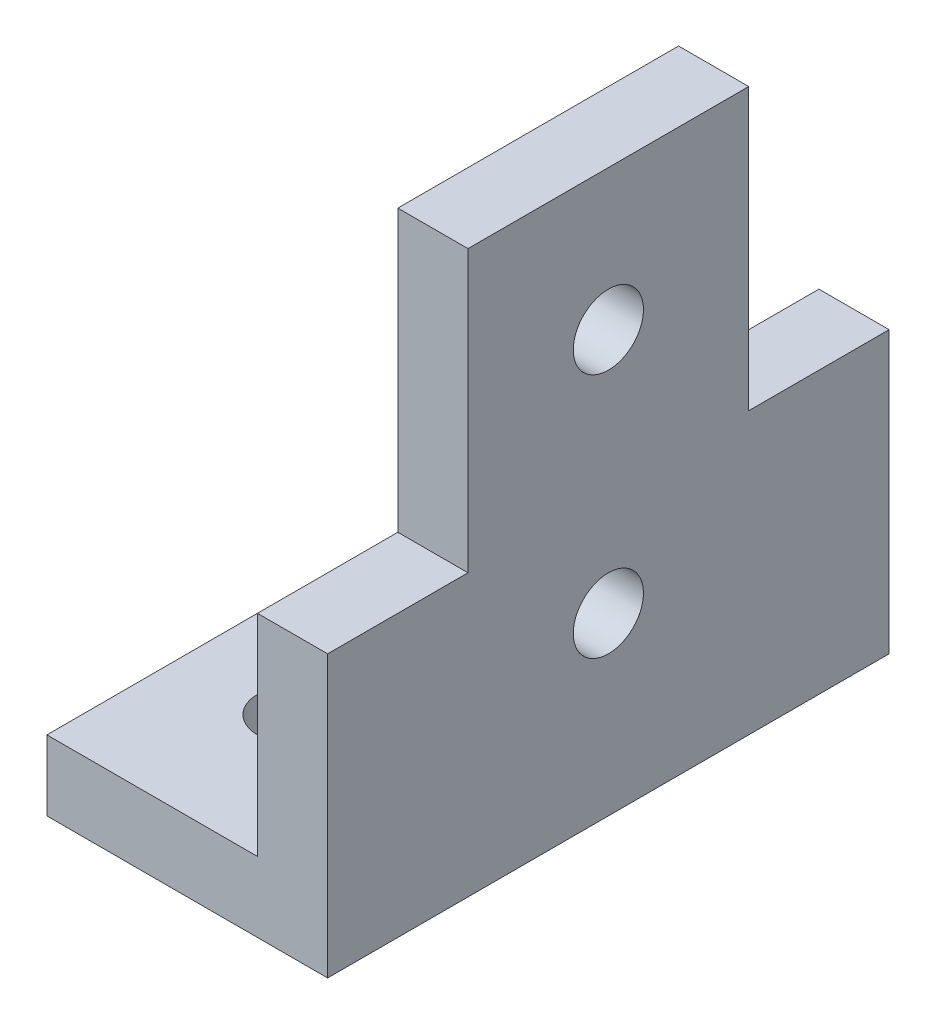
ISO-10303-21;
HEADER;
FILE_DESCRIPTION(('STEP AP214'),'2;1');
FILE_NAME('part.step','',(''),(''),'','','');
FILE_SCHEMA(('AUTOMOTIVE_DESIGN { 1 0 10303 214 1 1 1 1 }'));
ENDSEC;
DATA;
#1=APPLICATION_CONTEXT('core data for automotive mechanical design processes');
#2=APPLICATION_PROTOCOL_DEFINITION('international standard','automotive_design',2000,#1);
#3=PRODUCT_CONTEXT('',#1,'mechanical');
#4=PRODUCT('Part','Part','',(#3));
#5=PRODUCT_RELATED_PRODUCT_CATEGORY('part','',(#4));
#6=PRODUCT_DEFINITION_FORMATION('','',#4);
#7=PRODUCT_DEFINITION_CONTEXT('part definition',#1,'design');
#8=PRODUCT_DEFINITION('design','',#6,#7);
#9=PRODUCT_DEFINITION_SHAPE('','',#8);
#10=(LENGTH_UNIT() NAMED_UNIT(*) SI_UNIT(.MILLI.,.METRE.));
#11=(NAMED_UNIT(*) PLANE_ANGLE_UNIT() SI_UNIT($,.RADIAN.));
#12=(NAMED_UNIT(*) SI_UNIT($,.STERADIAN.) SOLID_ANGLE_UNIT());
#13=UNCERTAINTY_MEASURE_WITH_UNIT(LENGTH_MEASURE(1.E-05),#10,'distance_accuracy_value','');
#14=(GEOMETRIC_REPRESENTATION_CONTEXT(3) GLOBAL_UNCERTAINTY_ASSIGNED_CONTEXT((#13)) GLOBAL_UNIT_ASSIGNED_CONTEXT((#10,
#11,#12)) REPRESENTATION_CONTEXT('',''));
#15=CARTESIAN_POINT('',(0.,0.,0.));
#16=DIRECTION('',(0.,0.,1.));
#17=DIRECTION('',(1.,0.,0.));
#18=AXIS2_PLACEMENT_3D('',#15,#16,#17);
#19=CARTESIAN_POINT('',(25.4,25.4,50.8));
#20=DIRECTION('',(0.,-1.,0.));
#21=DIRECTION('',(1.,0.,0.));
#22=AXIS2_PLACEMENT_3D('',#19,#20,#21);
#23=PLANE('',#22);
#24=DIRECTION('',(-1.,0.,0.));
#25=VECTOR('',#24,1.);
#26=CARTESIAN_POINT('',(25.4,25.4,12.7));
#27=LINE('',#26,#25);
#28=CARTESIAN_POINT('',(25.4,25.4,12.7));
#29=VERTEX_POINT('',#28);
#30=CARTESIAN_POINT('',(19.05,25.4,12.7));
#31=VERTEX_POINT('',#30);
#32=EDGE_CURVE('E174',#29,#31,#27,.T.);
#33=ORIENTED_EDGE('',*,*,#32,.F.);
#34=DIRECTION('',(0.,0.,-1.));
#35=VECTOR('',#34,1.);
#36=CARTESIAN_POINT('',(25.4,25.4,50.8));
#37=LINE('',#36,#35);
#38=CARTESIAN_POINT('',(25.4,25.4,0.));
#39=VERTEX_POINT('',#38);
#40=EDGE_CURVE('E123',#29,#39,#37,.T.);
#41=ORIENTED_EDGE('',*,*,#40,.T.);
#42=DIRECTION('',(-1.,0.,0.));
#43=VECTOR('',#42,1.);
#44=CARTESIAN_POINT('',(25.4,25.4,0.));
#45=LINE('',#44,#43);
#46=CARTESIAN_POINT('',(19.05,25.4,0.));
#47=VERTEX_POINT('',#46);
#48=EDGE_CURVE('E144',#39,#47,#45,.T.);
#49=ORIENTED_EDGE('',*,*,#48,.T.);
#50=DIRECTION('',(0.,0.,-1.));
#51=VECTOR('',#50,1.);
#52=CARTESIAN_POINT('',(19.05,25.4,50.8));
#53=LINE('',#52,#51);
#54=EDGE_CURVE('E124',#31,#47,#53,.T.);
#55=ORIENTED_EDGE('',*,*,#54,.F.);
#56=EDGE_LOOP('',(#33,#41,#49,#55));
#57=FACE_BOUND('',#56,.T.);
#58=ADVANCED_FACE('F35',(#57),#23,.F.);
#59=CARTESIAN_POINT('',(0.,0.,50.8));
#60=DIRECTION('',(1.,0.,0.));
#61=DIRECTION('',(0.,0.,-1.));
#62=AXIS2_PLACEMENT_3D('',#59,#60,#61);
#63=PLANE('',#62);
#64=DIRECTION('',(0.,-1.,0.));
#65=VECTOR('',#64,1.);
#66=CARTESIAN_POINT('',(0.,0.,0.));
#67=LINE('',#66,#65);
#68=CARTESIAN_POINT('',(0.,6.35,0.));
#69=VERTEX_POINT('',#68);
#70=CARTESIAN_POINT('',(0.,0.,0.));
#71=VERTEX_POINT('',#70);
#72=EDGE_CURVE('E134',#69,#71,#67,.T.);
#73=ORIENTED_EDGE('',*,*,#72,.T.);
#74=DIRECTION('',(0.,0.,-1.));
#75=VECTOR('',#74,1.);
#76=CARTESIAN_POINT('',(0.,0.,50.8));
#77=LINE('',#76,#75);
#78=CARTESIAN_POINT('',(0.,0.,50.8));
#79=VERTEX_POINT('',#78);
#80=EDGE_CURVE('E11',#79,#71,#77,.T.);
#81=ORIENTED_EDGE('',*,*,#80,.F.);
#82=DIRECTION('',(0.,-1.,0.));
#83=VECTOR('',#82,1.);
#84=CARTESIAN_POINT('',(0.,0.,50.8));
#85=LINE('',#84,#83);
#86=CARTESIAN_POINT('',(0.,6.35,50.8));
#87=VERTEX_POINT('',#86);
#88=EDGE_CURVE('E150',#87,#79,#85,.T.);
#89=ORIENTED_EDGE('',*,*,#88,.F.);
#90=DIRECTION('',(0.,0.,-1.));
#91=VECTOR('',#90,1.);
#92=CARTESIAN_POINT('',(0.,6.35,50.8));
#93=LINE('',#92,#91);
#94=EDGE_CURVE('E130',#87,#69,#93,.T.);
#95=ORIENTED_EDGE('',*,*,#94,.T.);
#96=EDGE_LOOP('',(#73,#81,#89,#95));
#97=FACE_BOUND('',#96,.T.);
#98=ADVANCED_FACE('F37',(#97),#63,.F.);
#99=CARTESIAN_POINT('',(0.,0.,50.8));
#100=DIRECTION('',(0.,1.,0.));
#101=DIRECTION('',(0.,0.,1.));
#102=AXIS2_PLACEMENT_3D('',#99,#100,#101);
#103=PLANE('',#102);
#104=CARTESIAN_POINT('',(9.525,0.,38.1));
#105=DIRECTION('',(0.,1.,0.));
#106=DIRECTION('',(0.,0.,1.));
#107=AXIS2_PLACEMENT_3D('',#104,#105,#106);
#108=CIRCLE('',#107,3.175);
#109=CARTESIAN_POINT('',(9.525,0.,41.275));
#110=VERTEX_POINT('',#109);
#111=EDGE_CURVE('E287',#110,#110,#108,.F.);
#112=ORIENTED_EDGE('',*,*,#111,.F.);
#113=EDGE_LOOP('',(#112));
#114=FACE_BOUND('',#113,.T.);
#115=CARTESIAN_POINT('',(9.525,0.,12.7));
#116=DIRECTION('',(0.,1.,0.));
#117=DIRECTION('',(0.,0.,1.));
#118=AXIS2_PLACEMENT_3D('',#115,#116,#117);
#119=CIRCLE('',#118,3.175);
#120=CARTESIAN_POINT('',(9.525,0.,15.875));
#121=VERTEX_POINT('',#120);
#122=EDGE_CURVE('E138',#121,#121,#119,.F.);
#123=ORIENTED_EDGE('',*,*,#122,.F.);
#124=EDGE_LOOP('',(#123));
#125=FACE_BOUND('',#124,.T.);
#126=DIRECTION('',(1.,0.,0.));
#127=VECTOR('',#126,1.);
#128=CARTESIAN_POINT('',(0.,0.,0.));
#129=LINE('',#128,#127);
#130=CARTESIAN_POINT('',(25.4,0.,0.));
#131=VERTEX_POINT('',#130);
#132=EDGE_CURVE('E137',#71,#131,#129,.T.);
#133=ORIENTED_EDGE('',*,*,#132,.T.);
#134=DIRECTION('',(0.,0.,-1.));
#135=VECTOR('',#134,1.);
#136=CARTESIAN_POINT('',(25.4,0.,50.8));
#137=LINE('',#136,#135);
#138=CARTESIAN_POINT('',(25.4,0.,50.8));
#139=VERTEX_POINT('',#138);
#140=EDGE_CURVE('E44',#139,#131,#137,.T.);
#141=ORIENTED_EDGE('',*,*,#140,.F.);
#142=DIRECTION('',(1.,0.,0.));
#143=VECTOR('',#142,1.);
#144=CARTESIAN_POINT('',(0.,0.,50.8));
#145=LINE('',#144,#143);
#146=EDGE_CURVE('E96',#79,#139,#145,.T.);
#147=ORIENTED_EDGE('',*,*,#146,.F.);
#148=ORIENTED_EDGE('',*,*,#80,.T.);
#149=EDGE_LOOP('',(#133,#141,#147,#148));
#150=FACE_BOUND('',#149,.T.);
#151=ADVANCED_FACE('F246',(#114,#125,#150),#103,.F.);
#152=CARTESIAN_POINT('',(25.4,16.8521862769744,50.8));
#153=DIRECTION('',(-1.,0.,0.));
#154=DIRECTION('',(0.,0.,1.));
#155=AXIS2_PLACEMENT_3D('',#152,#153,#154);
#156=PLANE('',#155);
#157=CARTESIAN_POINT('',(25.4,15.875,25.4));
#158=DIRECTION('',(-1.,0.,0.));
#159=DIRECTION('',(0.,0.,1.));
#160=AXIS2_PLACEMENT_3D('',#157,#158,#159);
#161=CIRCLE('',#160,3.175);
#162=CARTESIAN_POINT('',(25.4,15.875,28.575));
#163=VERTEX_POINT('',#162);
#164=EDGE_CURVE('E216',#163,#163,#161,.F.);
#165=ORIENTED_EDGE('',*,*,#164,.F.);
#166=EDGE_LOOP('',(#165));
#167=FACE_BOUND('',#166,.T.);
#168=DIRECTION('',(0.,1.,0.));
#169=VECTOR('',#168,1.);
#170=CARTESIAN_POINT('',(25.4,16.8521862769744,0.));
#171=LINE('',#170,#169);
#172=EDGE_CURVE('E141',#131,#39,#171,.T.);
#173=ORIENTED_EDGE('',*,*,#172,.T.);
#174=ORIENTED_EDGE('',*,*,#40,.F.);
#175=DIRECTION('',(0.,-1.,0.));
#176=VECTOR('',#175,1.);
#177=CARTESIAN_POINT('',(25.4,25.4,12.7));
#178=LINE('',#177,#176);
#179=CARTESIAN_POINT('',(25.4,50.8,12.7));
#180=VERTEX_POINT('',#179);
#181=EDGE_CURVE('E190',#180,#29,#178,.T.);
#182=ORIENTED_EDGE('',*,*,#181,.F.);
#183=DIRECTION('',(0.,0.,-1.));
#184=VECTOR('',#183,1.);
#185=CARTESIAN_POINT('',(25.4,50.8,12.7));
#186=LINE('',#185,#184);
#187=CARTESIAN_POINT('',(25.4,50.8,38.1));
#188=VERTEX_POINT('',#187);
#189=EDGE_CURVE('E188',#188,#180,#186,.T.);
#190=ORIENTED_EDGE('',*,*,#189,.F.);
#191=DIRECTION('',(0.,1.,0.));
#192=VECTOR('',#191,1.);
#193=CARTESIAN_POINT('',(25.4,25.4,38.1));
#194=LINE('',#193,#192);
#195=CARTESIAN_POINT('',(25.4,25.4,38.1));
#196=VERTEX_POINT('',#195);
#197=EDGE_CURVE('E175',#196,#188,#194,.T.);
#198=ORIENTED_EDGE('',*,*,#197,.F.);
#199=CARTESIAN_POINT('',(25.4,25.4,50.8));
#200=VERTEX_POINT('',#199);
#201=EDGE_CURVE('E161',#200,#196,#37,.T.);
#202=ORIENTED_EDGE('',*,*,#201,.F.);
#203=DIRECTION('',(0.,1.,0.));
#204=VECTOR('',#203,1.);
#205=CARTESIAN_POINT('',(25.4,0.,50.8));
#206=LINE('',#205,#204);
#207=EDGE_CURVE('E113',#139,#200,#206,.T.);
#208=ORIENTED_EDGE('',*,*,#207,.F.);
#209=ORIENTED_EDGE('',*,*,#140,.T.);
#210=EDGE_LOOP('',(#173,#174,#182,#190,#198,#202,#208,#209));
#211=FACE_BOUND('',#210,.T.);
#212=CARTESIAN_POINT('',(25.4,38.1,25.4));
#213=DIRECTION('',(-1.,0.,0.));
#214=DIRECTION('',(0.,0.,1.));
#215=AXIS2_PLACEMENT_3D('',#212,#213,#214);
#216=CIRCLE('',#215,3.175);
#217=CARTESIAN_POINT('',(25.4,38.1,28.575));
#218=VERTEX_POINT('',#217);
#219=EDGE_CURVE('E195',#218,#218,#216,.T.);
#220=ORIENTED_EDGE('',*,*,#219,.T.);
#221=EDGE_LOOP('',(#220));
#222=FACE_BOUND('',#221,.T.);
#223=ADVANCED_FACE('F252',(#167,#211,#222),#156,.F.);
#224=ORIENTED_EDGE('',*,*,#201,.T.);
#225=DIRECTION('',(-1.,0.,0.));
#226=VECTOR('',#225,1.);
#227=CARTESIAN_POINT('',(25.4,25.4,38.1));
#228=LINE('',#227,#226);
#229=CARTESIAN_POINT('',(19.05,25.4,38.1));
#230=VERTEX_POINT('',#229);
#231=EDGE_CURVE('E121',#196,#230,#228,.T.);
#232=ORIENTED_EDGE('',*,*,#231,.T.);
#233=CARTESIAN_POINT('',(19.05,25.4,50.8));
#234=VERTEX_POINT('',#233);
#235=EDGE_CURVE('E119',#234,#230,#53,.T.);
#236=ORIENTED_EDGE('',*,*,#235,.F.);
#237=DIRECTION('',(-1.,0.,0.));
#238=VECTOR('',#237,1.);
#239=CARTESIAN_POINT('',(25.4,25.4,50.8));
#240=LINE('',#239,#238);
#241=EDGE_CURVE('E106',#200,#234,#240,.T.);
#242=ORIENTED_EDGE('',*,*,#241,.F.);
#243=EDGE_LOOP('',(#224,#232,#236,#242));
#244=FACE_BOUND('',#243,.T.);
#245=ADVANCED_FACE('F120',(#244),#23,.F.);
#246=CARTESIAN_POINT('',(19.05,6.35,50.8));
#247=DIRECTION('',(1.,0.,0.));
#248=DIRECTION('',(0.,0.,-1.));
#249=AXIS2_PLACEMENT_3D('',#246,#247,#248);
#250=PLANE('',#249);
#251=CARTESIAN_POINT('',(19.05,15.875,25.4));
#252=DIRECTION('',(-1.,0.,0.));
#253=DIRECTION('',(0.,0.,1.));
#254=AXIS2_PLACEMENT_3D('',#251,#252,#253);
#255=CIRCLE('',#254,3.175);
#256=CARTESIAN_POINT('',(19.05,15.875,28.575));
#257=VERTEX_POINT('',#256);
#258=EDGE_CURVE('E183',#257,#257,#255,.T.);
#259=ORIENTED_EDGE('',*,*,#258,.F.);
#260=EDGE_LOOP('',(#259));
#261=FACE_BOUND('',#260,.T.);
#262=DIRECTION('',(0.,-1.,0.));
#263=VECTOR('',#262,1.);
#264=CARTESIAN_POINT('',(19.05,6.35,0.));
#265=LINE('',#264,#263);
#266=CARTESIAN_POINT('',(19.05,6.35,0.));
#267=VERTEX_POINT('',#266);
#268=EDGE_CURVE('E147',#47,#267,#265,.T.);
#269=ORIENTED_EDGE('',*,*,#268,.T.);
#270=DIRECTION('',(0.,0.,-1.));
#271=VECTOR('',#270,1.);
#272=CARTESIAN_POINT('',(19.05,6.35,50.8));
#273=LINE('',#272,#271);
#274=CARTESIAN_POINT('',(19.05,6.35,50.8));
#275=VERTEX_POINT('',#274);
#276=EDGE_CURVE('E128',#275,#267,#273,.T.);
#277=ORIENTED_EDGE('',*,*,#276,.F.);
#278=DIRECTION('',(0.,-1.,0.));
#279=VECTOR('',#278,1.);
#280=CARTESIAN_POINT('',(19.05,6.35,50.8));
#281=LINE('',#280,#279);
#282=EDGE_CURVE('E110',#234,#275,#281,.T.);
#283=ORIENTED_EDGE('',*,*,#282,.F.);
#284=ORIENTED_EDGE('',*,*,#235,.T.);
#285=DIRECTION('',(0.,1.,0.));
#286=VECTOR('',#285,1.);
#287=CARTESIAN_POINT('',(19.05,25.4,38.1));
#288=LINE('',#287,#286);
#289=CARTESIAN_POINT('',(19.05,50.8,38.1));
#290=VERTEX_POINT('',#289);
#291=EDGE_CURVE('E52',#230,#290,#288,.T.);
#292=ORIENTED_EDGE('',*,*,#291,.T.);
#293=DIRECTION('',(0.,0.,-1.));
#294=VECTOR('',#293,1.);
#295=CARTESIAN_POINT('',(19.05,50.8,12.7));
#296=LINE('',#295,#294);
#297=CARTESIAN_POINT('',(19.05,50.8,12.7));
#298=VERTEX_POINT('',#297);
#299=EDGE_CURVE('E167',#290,#298,#296,.T.);
#300=ORIENTED_EDGE('',*,*,#299,.T.);
#301=DIRECTION('',(0.,-1.,0.));
#302=VECTOR('',#301,1.);
#303=CARTESIAN_POINT('',(19.05,25.4,12.7));
#304=LINE('',#303,#302);
#305=EDGE_CURVE('E168',#298,#31,#304,.T.);
#306=ORIENTED_EDGE('',*,*,#305,.T.);
#307=ORIENTED_EDGE('',*,*,#54,.T.);
#308=EDGE_LOOP('',(#269,#277,#283,#284,#292,#300,#306,#307));
#309=FACE_BOUND('',#308,.T.);
#310=CARTESIAN_POINT('',(19.05,38.1,25.4));
#311=DIRECTION('',(-1.,0.,0.));
#312=DIRECTION('',(0.,0.,1.));
#313=AXIS2_PLACEMENT_3D('',#310,#311,#312);
#314=CIRCLE('',#313,3.175);
#315=CARTESIAN_POINT('',(19.05,38.1,28.575));
#316=VERTEX_POINT('',#315);
#317=EDGE_CURVE('E201',#316,#316,#314,.T.);
#318=ORIENTED_EDGE('',*,*,#317,.F.);
#319=EDGE_LOOP('',(#318));
#320=FACE_BOUND('',#319,.T.);
#321=ADVANCED_FACE('F126',(#261,#309,#320),#250,.F.);
#322=CARTESIAN_POINT('',(0.,6.35,50.8));
#323=DIRECTION('',(0.,-1.,0.));
#324=DIRECTION('',(1.,0.,0.));
#325=AXIS2_PLACEMENT_3D('',#322,#323,#324);
#326=PLANE('',#325);
#327=CARTESIAN_POINT('',(9.525,6.35,38.1));
#328=DIRECTION('',(0.,1.,0.));
#329=DIRECTION('',(-1.,0.,0.));
#330=AXIS2_PLACEMENT_3D('',#327,#328,#329);
#331=CIRCLE('',#330,3.175);
#332=CARTESIAN_POINT('',(6.35,6.35,38.1));
#333=VERTEX_POINT('',#332);
#334=EDGE_CURVE('E290',#333,#333,#331,.T.);
#335=ORIENTED_EDGE('',*,*,#334,.F.);
#336=EDGE_LOOP('',(#335));
#337=FACE_BOUND('',#336,.T.);
#338=CARTESIAN_POINT('',(9.525,6.35,12.7));
#339=DIRECTION('',(0.,1.,0.));
#340=DIRECTION('',(-1.,0.,0.));
#341=AXIS2_PLACEMENT_3D('',#338,#339,#340);
#342=CIRCLE('',#341,3.175);
#343=CARTESIAN_POINT('',(6.35,6.35,12.7));
#344=VERTEX_POINT('',#343);
#345=EDGE_CURVE('E284',#344,#344,#342,.T.);
#346=ORIENTED_EDGE('',*,*,#345,.F.);
#347=EDGE_LOOP('',(#346));
#348=FACE_BOUND('',#347,.T.);
#349=DIRECTION('',(-1.,0.,0.));
#350=VECTOR('',#349,1.);
#351=CARTESIAN_POINT('',(0.,6.35,0.));
#352=LINE('',#351,#350);
#353=EDGE_CURVE('E88',#267,#69,#352,.T.);
#354=ORIENTED_EDGE('',*,*,#353,.T.);
#355=ORIENTED_EDGE('',*,*,#94,.F.);
#356=DIRECTION('',(-1.,0.,0.));
#357=VECTOR('',#356,1.);
#358=CARTESIAN_POINT('',(0.,6.35,50.8));
#359=LINE('',#358,#357);
#360=EDGE_CURVE('E61',#275,#87,#359,.T.);
#361=ORIENTED_EDGE('',*,*,#360,.F.);
#362=ORIENTED_EDGE('',*,*,#276,.T.);
#363=EDGE_LOOP('',(#354,#355,#361,#362));
#364=FACE_BOUND('',#363,.T.);
#365=ADVANCED_FACE('F257',(#337,#348,#364),#326,.F.);
#366=CARTESIAN_POINT('',(0.,0.,50.8));
#367=DIRECTION('',(0.,0.,-1.));
#368=DIRECTION('',(-1.,0.,0.));
#369=AXIS2_PLACEMENT_3D('',#366,#367,#368);
#370=PLANE('',#369);
#371=ORIENTED_EDGE('',*,*,#88,.T.);
#372=ORIENTED_EDGE('',*,*,#146,.T.);
#373=ORIENTED_EDGE('',*,*,#207,.T.);
#374=ORIENTED_EDGE('',*,*,#241,.T.);
#375=ORIENTED_EDGE('',*,*,#282,.T.);
#376=ORIENTED_EDGE('',*,*,#360,.T.);
#377=EDGE_LOOP('',(#371,#372,#373,#374,#375,#376));
#378=FACE_BOUND('',#377,.T.);
#379=ADVANCED_FACE('F108',(#378),#370,.F.);
#380=CARTESIAN_POINT('',(0.,0.,0.));
#381=DIRECTION('',(0.,0.,-1.));
#382=DIRECTION('',(-1.,0.,0.));
#383=AXIS2_PLACEMENT_3D('',#380,#381,#382);
#384=PLANE('',#383);
#385=ORIENTED_EDGE('',*,*,#72,.F.);
#386=ORIENTED_EDGE('',*,*,#353,.F.);
#387=ORIENTED_EDGE('',*,*,#268,.F.);
#388=ORIENTED_EDGE('',*,*,#48,.F.);
#389=ORIENTED_EDGE('',*,*,#172,.F.);
#390=ORIENTED_EDGE('',*,*,#132,.F.);
#391=EDGE_LOOP('',(#385,#386,#387,#388,#389,#390));
#392=FACE_BOUND('',#391,.T.);
#393=ADVANCED_FACE('F273',(#392),#384,.T.);
#394=CARTESIAN_POINT('',(9.525,-0.001000000000001,12.7));
#395=DIRECTION('',(0.,1.,0.));
#396=DIRECTION('',(-1.,0.,0.));
#397=AXIS2_PLACEMENT_3D('',#394,#395,#396);
#398=CYLINDRICAL_SURFACE('',#397,3.175);
#399=ORIENTED_EDGE('',*,*,#345,.T.);
#400=EDGE_LOOP('',(#399));
#401=FACE_BOUND('',#400,.T.);
#402=ORIENTED_EDGE('',*,*,#122,.T.);
#403=EDGE_LOOP('',(#402));
#404=FACE_BOUND('',#403,.T.);
#405=ADVANCED_FACE('F299',(#401,#404),#398,.F.);
#406=CARTESIAN_POINT('',(9.525,-0.001000000000001,38.1));
#407=DIRECTION('',(0.,1.,0.));
#408=DIRECTION('',(-1.,0.,0.));
#409=AXIS2_PLACEMENT_3D('',#406,#407,#408);
#410=CYLINDRICAL_SURFACE('',#409,3.175);
#411=ORIENTED_EDGE('',*,*,#334,.T.);
#412=EDGE_LOOP('',(#411));
#413=FACE_BOUND('',#412,.T.);
#414=ORIENTED_EDGE('',*,*,#111,.T.);
#415=EDGE_LOOP('',(#414));
#416=FACE_BOUND('',#415,.T.);
#417=ADVANCED_FACE('F294',(#413,#416),#410,.F.);
#418=CARTESIAN_POINT('',(25.401,15.875,25.4));
#419=DIRECTION('',(-1.,0.,0.));
#420=DIRECTION('',(0.,0.,1.));
#421=AXIS2_PLACEMENT_3D('',#418,#419,#420);
#422=CYLINDRICAL_SURFACE('',#421,3.175);
#423=CARTESIAN_POINT('',(19.05,15.875,28.575));
#424=CARTESIAN_POINT('',(19.1161458333333,15.875,28.575));
#425=CARTESIAN_POINT('',(19.1822916666667,15.875,28.575));
#426=CARTESIAN_POINT('',(19.3145833333333,15.875,28.575));
#427=CARTESIAN_POINT('',(19.3807291666667,15.875,28.575));
#428=CARTESIAN_POINT('',(19.5130208333333,15.875,28.575));
#429=CARTESIAN_POINT('',(19.5791666666667,15.875,28.575));
#430=CARTESIAN_POINT('',(19.7114583333333,15.875,28.575));
#431=CARTESIAN_POINT('',(19.7776041666667,15.875,28.575));
#432=CARTESIAN_POINT('',(19.9098958333333,15.875,28.575));
#433=CARTESIAN_POINT('',(19.9760416666667,15.875,28.575));
#434=CARTESIAN_POINT('',(20.1083333333333,15.875,28.575));
#435=CARTESIAN_POINT('',(20.1744791666667,15.875,28.575));
#436=CARTESIAN_POINT('',(20.3067708333333,15.875,28.575));
#437=CARTESIAN_POINT('',(20.3729166666667,15.875,28.575));
#438=CARTESIAN_POINT('',(20.5052083333333,15.875,28.575));
#439=CARTESIAN_POINT('',(20.5713541666667,15.875,28.575));
#440=CARTESIAN_POINT('',(20.7036458333333,15.875,28.575));
#441=CARTESIAN_POINT('',(20.7697916666667,15.875,28.575));
#442=CARTESIAN_POINT('',(20.9020833333333,15.875,28.575));
#443=CARTESIAN_POINT('',(20.9682291666667,15.875,28.575));
#444=CARTESIAN_POINT('',(21.1005208333333,15.875,28.575));
#445=CARTESIAN_POINT('',(21.1666666666667,15.875,28.575));
#446=CARTESIAN_POINT('',(21.2989583333333,15.875,28.575));
#447=CARTESIAN_POINT('',(21.3651041666667,15.875,28.575));
#448=CARTESIAN_POINT('',(21.4973958333333,15.875,28.575));
#449=CARTESIAN_POINT('',(21.5635416666667,15.875,28.575));
#450=CARTESIAN_POINT('',(21.6958333333333,15.875,28.575));
#451=CARTESIAN_POINT('',(21.7619791666667,15.875,28.575));
#452=CARTESIAN_POINT('',(21.8942708333333,15.875,28.575));
#453=CARTESIAN_POINT('',(21.9604166666667,15.875,28.575));
#454=CARTESIAN_POINT('',(22.0927083333333,15.875,28.575));
#455=CARTESIAN_POINT('',(22.1588541666667,15.875,28.575));
#456=CARTESIAN_POINT('',(22.2911458333333,15.875,28.575));
#457=CARTESIAN_POINT('',(22.3572916666667,15.875,28.575));
#458=CARTESIAN_POINT('',(22.4895833333333,15.875,28.575));
#459=CARTESIAN_POINT('',(22.5557291666667,15.875,28.575));
#460=CARTESIAN_POINT('',(22.6880208333333,15.875,28.575));
#461=CARTESIAN_POINT('',(22.7541666666667,15.875,28.575));
#462=CARTESIAN_POINT('',(22.8864583333333,15.875,28.575));
#463=CARTESIAN_POINT('',(22.9526041666667,15.875,28.575));
#464=CARTESIAN_POINT('',(23.0848958333333,15.875,28.575));
#465=CARTESIAN_POINT('',(23.1510416666667,15.875,28.575));
#466=CARTESIAN_POINT('',(23.2833333333333,15.875,28.575));
#467=CARTESIAN_POINT('',(23.3494791666667,15.875,28.575));
#468=CARTESIAN_POINT('',(23.4817708333333,15.875,28.575));
#469=CARTESIAN_POINT('',(23.5479166666667,15.875,28.575));
#470=CARTESIAN_POINT('',(23.6802083333333,15.875,28.575));
#471=CARTESIAN_POINT('',(23.7463541666667,15.875,28.575));
#472=CARTESIAN_POINT('',(23.8786458333333,15.875,28.575));
#473=CARTESIAN_POINT('',(23.9447916666667,15.875,28.575));
#474=CARTESIAN_POINT('',(24.0770833333333,15.875,28.575));
#475=CARTESIAN_POINT('',(24.1432291666667,15.875,28.575));
#476=CARTESIAN_POINT('',(24.2755208333333,15.875,28.575));
#477=CARTESIAN_POINT('',(24.3416666666667,15.875,28.575));
#478=CARTESIAN_POINT('',(24.4739583333333,15.875,28.575));
#479=CARTESIAN_POINT('',(24.5401041666667,15.875,28.575));
#480=CARTESIAN_POINT('',(24.6723958333333,15.875,28.575));
#481=CARTESIAN_POINT('',(24.7385416666667,15.875,28.575));
#482=CARTESIAN_POINT('',(24.8708333333333,15.875,28.575));
#483=CARTESIAN_POINT('',(24.9369791666667,15.875,28.575));
#484=CARTESIAN_POINT('',(25.0692708333333,15.875,28.575));
#485=CARTESIAN_POINT('',(25.1354166666667,15.875,28.575));
#486=CARTESIAN_POINT('',(25.2677083333333,15.875,28.575));
#487=CARTESIAN_POINT('',(25.3338541666667,15.875,28.575));
#488=CARTESIAN_POINT('',(25.4,15.875,28.575));
#489=B_SPLINE_CURVE_WITH_KNOTS('',3,(#423,#424,#425,#426,#427,#428,#429,#430,#431,#432,#433,
#434,#435,#436,#437,#438,#439,#440,#441,#442,#443,#444,#445,#446,#447,#448,#449,#450,#451,#452,
#453,#454,#455,#456,#457,#458,#459,#460,#461,#462,#463,#464,#465,#466,#467,#468,#469,#470,#471,
#472,#473,#474,#475,#476,#477,#478,#479,#480,#481,#482,#483,#484,#485,#486,#487,#488),
.UNSPECIFIED.,.F.,.F.,(4,2,2,2,2,2,2,2,2,2,2,2,2,2,2,2,2,2,2,2,2,2,2,2,2,2,2,2,2,2,2,2,4),(0.,
0.198437499999999,0.396874999999998,0.5953125,0.793749999999999,0.992187499999998,1.190625,
1.3890625,1.5875,1.7859375,1.984375,2.1828125,2.38125,2.5796875,2.778125,2.9765625,3.175,
3.3734375,3.571875,3.7703125,3.96875,4.1671875,4.365625,4.5640625,4.7625,4.9609375,5.159375,
5.3578125,5.55625,5.7546875,5.953125,6.1515625,6.35),.UNSPECIFIED.);
#490=EDGE_CURVE('BSEAM234',#257,#163,#489,.T.);
#491=ORIENTED_EDGE('',*,*,#258,.T.);
#492=ORIENTED_EDGE('',*,*,#164,.T.);
#493=ORIENTED_EDGE('',*,*,#490,.T.);
#494=ORIENTED_EDGE('',*,*,#490,.F.);
#495=EDGE_LOOP('',(#491,#493,#492,#494));
#496=FACE_BOUND('',#495,.T.);
#497=ADVANCED_FACE('F234',(#496),#422,.F.);
#498=CARTESIAN_POINT('',(25.4,25.4,12.7));
#499=DIRECTION('',(0.,0.,-1.));
#500=DIRECTION('',(0.,1.,0.));
#501=AXIS2_PLACEMENT_3D('',#498,#499,#500);
#502=PLANE('',#501);
#503=ORIENTED_EDGE('',*,*,#305,.F.);
#504=DIRECTION('',(-1.,0.,0.));
#505=VECTOR('',#504,1.);
#506=CARTESIAN_POINT('',(25.4,50.8,12.7));
#507=LINE('',#506,#505);
#508=EDGE_CURVE('E210',#180,#298,#507,.T.);
#509=ORIENTED_EDGE('',*,*,#508,.F.);
#510=ORIENTED_EDGE('',*,*,#181,.T.);
#511=ORIENTED_EDGE('',*,*,#32,.T.);
#512=EDGE_LOOP('',(#503,#509,#510,#511));
#513=FACE_BOUND('',#512,.T.);
#514=ADVANCED_FACE('F226',(#513),#502,.T.);
#515=CARTESIAN_POINT('',(25.4,50.8,12.7));
#516=DIRECTION('',(0.,1.,0.));
#517=DIRECTION('',(0.,0.,1.));
#518=AXIS2_PLACEMENT_3D('',#515,#516,#517);
#519=PLANE('',#518);
#520=ORIENTED_EDGE('',*,*,#299,.F.);
#521=DIRECTION('',(-1.,0.,0.));
#522=VECTOR('',#521,1.);
#523=CARTESIAN_POINT('',(25.4,50.8,38.1));
#524=LINE('',#523,#522);
#525=EDGE_CURVE('E173',#188,#290,#524,.T.);
#526=ORIENTED_EDGE('',*,*,#525,.F.);
#527=ORIENTED_EDGE('',*,*,#189,.T.);
#528=ORIENTED_EDGE('',*,*,#508,.T.);
#529=EDGE_LOOP('',(#520,#526,#527,#528));
#530=FACE_BOUND('',#529,.T.);
#531=ADVANCED_FACE('F224',(#530),#519,.T.);
#532=CARTESIAN_POINT('',(25.4,25.4,38.1));
#533=DIRECTION('',(0.,0.,1.));
#534=DIRECTION('',(1.,0.,0.));
#535=AXIS2_PLACEMENT_3D('',#532,#533,#534);
#536=PLANE('',#535);
#537=ORIENTED_EDGE('',*,*,#291,.F.);
#538=ORIENTED_EDGE('',*,*,#231,.F.);
#539=ORIENTED_EDGE('',*,*,#197,.T.);
#540=ORIENTED_EDGE('',*,*,#525,.T.);
#541=EDGE_LOOP('',(#537,#538,#539,#540));
#542=FACE_BOUND('',#541,.T.);
#543=ADVANCED_FACE('F220',(#542),#536,.T.);
#544=CARTESIAN_POINT('',(25.4,38.1,25.4));
#545=DIRECTION('',(-1.,0.,0.));
#546=DIRECTION('',(0.,0.,1.));
#547=AXIS2_PLACEMENT_3D('',#544,#545,#546);
#548=CYLINDRICAL_SURFACE('',#547,3.175);
#549=ORIENTED_EDGE('',*,*,#219,.F.);
#550=EDGE_LOOP('',(#549));
#551=FACE_BOUND('',#550,.T.);
#552=ORIENTED_EDGE('',*,*,#317,.T.);
#553=EDGE_LOOP('',(#552));
#554=FACE_BOUND('',#553,.T.);
#555=ADVANCED_FACE('F232',(#551,#554),#548,.F.);
#556=CLOSED_SHELL('',(#58,#98,#151,#223,#245,#321,#365,#379,#393,#405,#417,#497,#514,#531,#543,#555));
#557=MANIFOLD_SOLID_BREP('B2',#556);
#558=ADVANCED_BREP_SHAPE_REPRESENTATION('',(#18,#557),#14);
#559=SHAPE_DEFINITION_REPRESENTATION(#9,#558);
ENDSEC;
END-ISO-10303-21;
